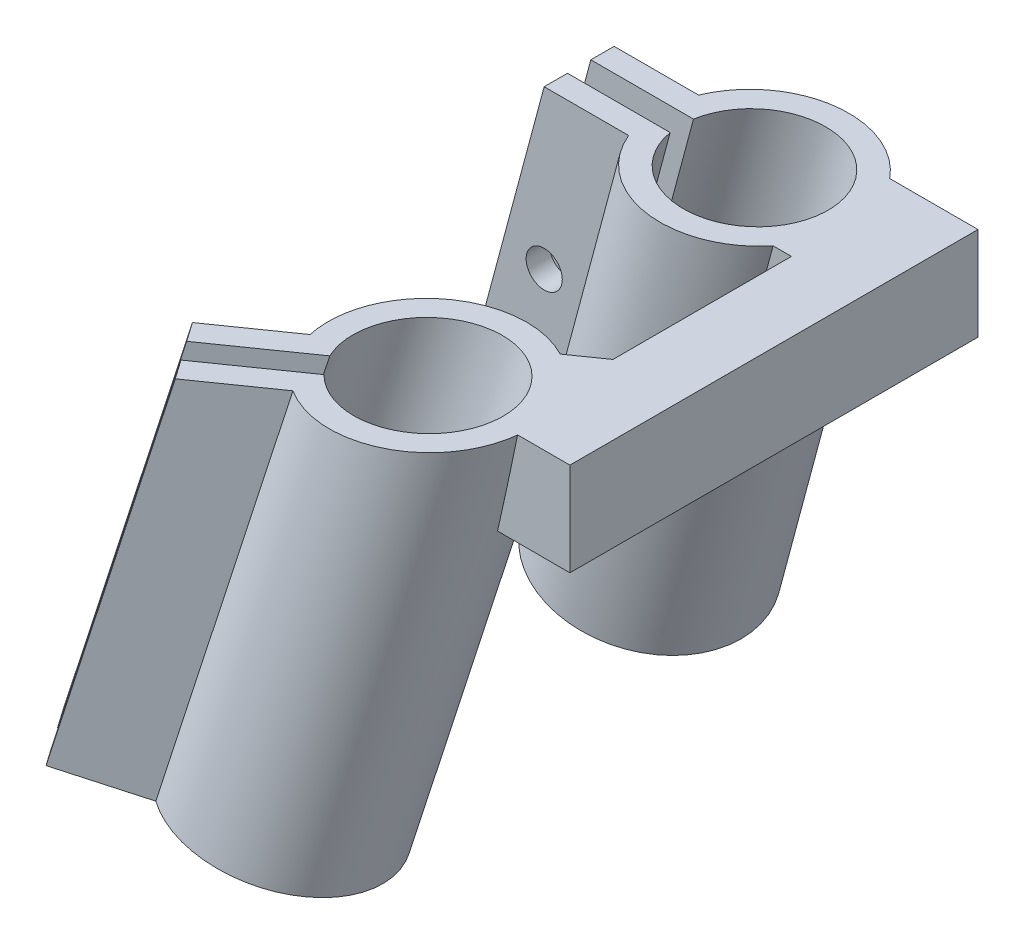
ISO-10303-21;
HEADER;
FILE_DESCRIPTION(('STEP AP214'),'2;1');
FILE_NAME('part.step','',(''),(''),'','','');
FILE_SCHEMA(('AUTOMOTIVE_DESIGN { 1 0 10303 214 1 1 1 1 }'));
ENDSEC;
DATA;
#1=APPLICATION_CONTEXT('core data for automotive mechanical design processes');
#2=APPLICATION_PROTOCOL_DEFINITION('international standard','automotive_design',2000,#1);
#3=PRODUCT_CONTEXT('',#1,'mechanical');
#4=PRODUCT('Part','Part','',(#3));
#5=PRODUCT_RELATED_PRODUCT_CATEGORY('part','',(#4));
#6=PRODUCT_DEFINITION_FORMATION('','',#4);
#7=PRODUCT_DEFINITION_CONTEXT('part definition',#1,'design');
#8=PRODUCT_DEFINITION('design','',#6,#7);
#9=PRODUCT_DEFINITION_SHAPE('','',#8);
#10=(LENGTH_UNIT() NAMED_UNIT(*) SI_UNIT(.MILLI.,.METRE.));
#11=(NAMED_UNIT(*) PLANE_ANGLE_UNIT() SI_UNIT($,.RADIAN.));
#12=(NAMED_UNIT(*) SI_UNIT($,.STERADIAN.) SOLID_ANGLE_UNIT());
#13=UNCERTAINTY_MEASURE_WITH_UNIT(LENGTH_MEASURE(1.E-05),#10,'distance_accuracy_value','');
#14=(GEOMETRIC_REPRESENTATION_CONTEXT(3) GLOBAL_UNCERTAINTY_ASSIGNED_CONTEXT((#13)) GLOBAL_UNIT_ASSIGNED_CONTEXT((#10,
#11,#12)) REPRESENTATION_CONTEXT('',''));
#15=CARTESIAN_POINT('',(0.,0.,0.));
#16=DIRECTION('',(0.,0.,1.));
#17=DIRECTION('',(1.,0.,0.));
#18=AXIS2_PLACEMENT_3D('',#15,#16,#17);
#19=CARTESIAN_POINT('',(-20.0828491488153,-29.4671269609686,4.57689308289988));
#20=DIRECTION('',(0.212012149896649,0.96592582628907,-0.148452505549681));
#21=DIRECTION('',(-0.976748652139604,0.2143876641588,0.));
#22=AXIS2_PLACEMENT_3D('',#19,#20,#21);
#23=CYLINDRICAL_SURFACE('',#22,6.1);
#24=DIRECTION('',(0.212012149896649,0.96592582628907,-0.148452505549681));
#25=VECTOR('',#24,1.);
#26=CARTESIAN_POINT('',(-25.417692844176,-27.9096899431465,7.09161626480049));
#27=LINE('',#26,#25);
#28=CARTESIAN_POINT('',(-25.3116867692277,-27.426727030002,7.01739001202565));
#29=VERTEX_POINT('',#28);
#30=CARTESIAN_POINT('',(-18.4137989806348,4.00000000000001,2.1874369847282));
#31=VERTEX_POINT('',#30);
#32=EDGE_CURVE('E54',#29,#31,#27,.T.);
#33=ORIENTED_EDGE('',*,*,#32,.F.);
#34=CARTESIAN_POINT('',(-19.976843073867,-28.9841640478241,4.50266683012504));
#35=DIRECTION('',(-0.212012149896649,-0.96592582628907,0.148452505549681));
#36=DIRECTION('',(0.976748652139604,-0.214387664158799,0.));
#37=AXIS2_PLACEMENT_3D('',#34,#35,#36);
#38=CIRCLE('',#37,6.1);
#39=CARTESIAN_POINT('',(-24.1645338965256,-27.426727030002,8.65569410060363));
#40=VERTEX_POINT('',#39);
#41=EDGE_CURVE('E58',#29,#40,#38,.T.);
#42=ORIENTED_EDGE('',*,*,#41,.T.);
#43=DIRECTION('',(0.212012149896649,0.96592582628907,-0.148452505549681));
#44=VECTOR('',#43,1.);
#45=CARTESIAN_POINT('',(-24.2705399714739,-27.9096899431465,8.72992035337847));
#46=LINE('',#45,#44);
#47=CARTESIAN_POINT('',(-17.2666461079327,4.00000000000001,3.82574107330618));
#48=VERTEX_POINT('',#47);
#49=EDGE_CURVE('E227',#40,#48,#46,.T.);
#50=ORIENTED_EDGE('',*,*,#49,.T.);
#51=CARTESIAN_POINT('',(-12.7371116762823,4.,-0.56664766907732));
#52=DIRECTION('',(0.,1.,0.));
#53=DIRECTION('',(-0.819152044288991,0.,0.573576436351047));
#54=AXIS2_PLACEMENT_3D('',#51,#52,#53);
#55=ELLIPSE('',#54,6.3151847005015,6.1);
#56=EDGE_CURVE('E271',#31,#48,#55,.F.);
#57=ORIENTED_EDGE('',*,*,#56,.F.);
#58=EDGE_LOOP('',(#33,#42,#50,#57));
#59=FACE_BOUND('',#58,.T.);
#60=ADVANCED_FACE('F39',(#59),#23,.F.);
#61=CARTESIAN_POINT('',(-6.52879480020904,4.,-9.32408528034679));
#62=DIRECTION('',(-0.573576436351047,0.,-0.819152044288991));
#63=DIRECTION('',(-0.819152044288991,0.,0.573576436351047));
#64=AXIS2_PLACEMENT_3D('',#61,#62,#63);
#65=PLANE('',#64);
#66=DIRECTION('',(0.212012149896649,0.96592582628907,-0.148452505549681));
#67=VECTOR('',#66,1.);
#68=CARTESIAN_POINT('',(-16.4187694416062,-31.3434881347056,-2.39905048373759));
#69=LINE('',#68,#67);
#70=CARTESIAN_POINT('',(-8.66118733711535,4.,-7.83096795158286));
#71=VERTEX_POINT('',#70);
#72=CARTESIAN_POINT('',(-10.4171163670796,-4.,-6.60145320824061));
#73=VERTEX_POINT('',#72);
#74=EDGE_CURVE('E312',#71,#73,#69,.F.);
#75=ORIENTED_EDGE('',*,*,#74,.F.);
#76=DIRECTION('',(0.819152044288991,0.,-0.573576436351047));
#77=VECTOR('',#76,1.);
#78=CARTESIAN_POINT('',(-6.52879480020904,4.,-9.32408528034679));
#79=LINE('',#78,#77);
#80=CARTESIAN_POINT('',(-6.,4.,-9.69435138561925));
#81=VERTEX_POINT('',#80);
#82=EDGE_CURVE('E411',#71,#81,#79,.T.);
#83=ORIENTED_EDGE('',*,*,#82,.T.);
#84=DIRECTION('',(0.,-1.,0.));
#85=VECTOR('',#84,1.);
#86=CARTESIAN_POINT('',(-6.,4.,-9.69435138561925));
#87=LINE('',#86,#85);
#88=CARTESIAN_POINT('',(-6.,-4.,-9.69435138561925));
#89=VERTEX_POINT('',#88);
#90=EDGE_CURVE('E426',#81,#89,#87,.T.);
#91=ORIENTED_EDGE('',*,*,#90,.T.);
#92=DIRECTION('',(0.819152044288991,0.,-0.573576436351047));
#93=VECTOR('',#92,1.);
#94=CARTESIAN_POINT('',(-6.52879480020904,-4.,-9.32408528034679));
#95=LINE('',#94,#93);
#96=EDGE_CURVE('E410',#73,#89,#95,.T.);
#97=ORIENTED_EDGE('',*,*,#96,.F.);
#98=EDGE_LOOP('',(#75,#83,#91,#97));
#99=FACE_BOUND('',#98,.T.);
#100=ADVANCED_FACE('F41',(#99),#65,.T.);
#101=CARTESIAN_POINT('',(0.,4.,0.));
#102=DIRECTION('',(0.,0.,1.));
#103=DIRECTION('',(1.,0.,0.));
#104=AXIS2_PLACEMENT_3D('',#101,#102,#103);
#105=PLANE('',#104);
#106=CARTESIAN_POINT('',(-13.5463684154001,0.313032131444138,0.));
#107=DIRECTION('',(0.,0.,1.));
#108=DIRECTION('',(0.2143876641588,0.976748652139604,0.));
#109=AXIS2_PLACEMENT_3D('',#106,#107,#108);
#110=ELLIPSE('',#109,54.5629052875045,8.1);
#111=CARTESIAN_POINT('',(-6.20993348731184,-4.,0.));
#112=VERTEX_POINT('',#111);
#113=CARTESIAN_POINT('',(-4.48720229842507,4.,0.));
#114=VERTEX_POINT('',#113);
#115=EDGE_CURVE('E295',#112,#114,#110,.T.);
#116=ORIENTED_EDGE('',*,*,#115,.F.);
#117=DIRECTION('',(-1.,0.,0.));
#118=VECTOR('',#117,1.);
#119=CARTESIAN_POINT('',(0.,-4.,0.));
#120=LINE('',#119,#118);
#121=CARTESIAN_POINT('',(0.,-4.,0.));
#122=VERTEX_POINT('',#121);
#123=EDGE_CURVE('E428',#122,#112,#120,.T.);
#124=ORIENTED_EDGE('',*,*,#123,.F.);
#125=DIRECTION('',(0.,-1.,0.));
#126=VECTOR('',#125,1.);
#127=CARTESIAN_POINT('',(0.,4.,0.));
#128=LINE('',#127,#126);
#129=CARTESIAN_POINT('',(0.,4.,0.));
#130=VERTEX_POINT('',#129);
#131=EDGE_CURVE('E448',#130,#122,#128,.T.);
#132=ORIENTED_EDGE('',*,*,#131,.F.);
#133=DIRECTION('',(-1.,0.,0.));
#134=VECTOR('',#133,1.);
#135=CARTESIAN_POINT('',(0.,4.,0.));
#136=LINE('',#135,#134);
#137=EDGE_CURVE('E413',#130,#114,#136,.T.);
#138=ORIENTED_EDGE('',*,*,#137,.T.);
#139=EDGE_LOOP('',(#116,#124,#132,#138));
#140=FACE_BOUND('',#139,.T.);
#141=ADVANCED_FACE('F476',(#140),#105,.T.);
#142=CARTESIAN_POINT('',(0.,4.,0.));
#143=DIRECTION('',(-1.,0.,0.));
#144=DIRECTION('',(0.,0.,1.));
#145=AXIS2_PLACEMENT_3D('',#142,#143,#144);
#146=PLANE('',#145);
#147=DIRECTION('',(0.,0.,-1.));
#148=VECTOR('',#147,1.);
#149=CARTESIAN_POINT('',(0.,-4.,0.));
#150=LINE('',#149,#148);
#151=CARTESIAN_POINT('',(0.,-4.,-35.));
#152=VERTEX_POINT('',#151);
#153=EDGE_CURVE('E431',#122,#152,#150,.T.);
#154=ORIENTED_EDGE('',*,*,#153,.T.);
#155=DIRECTION('',(0.,-1.,0.));
#156=VECTOR('',#155,1.);
#157=CARTESIAN_POINT('',(0.,4.,-35.));
#158=LINE('',#157,#156);
#159=CARTESIAN_POINT('',(0.,4.,-35.));
#160=VERTEX_POINT('',#159);
#161=EDGE_CURVE('E445',#160,#152,#158,.T.);
#162=ORIENTED_EDGE('',*,*,#161,.F.);
#163=DIRECTION('',(0.,0.,-1.));
#164=VECTOR('',#163,1.);
#165=CARTESIAN_POINT('',(0.,4.,0.));
#166=LINE('',#165,#164);
#167=EDGE_CURVE('E416',#130,#160,#166,.T.);
#168=ORIENTED_EDGE('',*,*,#167,.F.);
#169=ORIENTED_EDGE('',*,*,#131,.T.);
#170=EDGE_LOOP('',(#154,#162,#168,#169));
#171=FACE_BOUND('',#170,.T.);
#172=ADVANCED_FACE('F587',(#171),#146,.F.);
#173=CARTESIAN_POINT('',(0.,4.,-35.));
#174=DIRECTION('',(0.,0.,1.));
#175=DIRECTION('',(1.,0.,0.));
#176=AXIS2_PLACEMENT_3D('',#173,#174,#175);
#177=PLANE('',#176);
#178=DIRECTION('',(-1.,0.,0.));
#179=VECTOR('',#178,1.);
#180=CARTESIAN_POINT('',(0.,-4.,-35.));
#181=LINE('',#180,#179);
#182=CARTESIAN_POINT('',(-9.71778621181587,-4.,-35.));
#183=VERTEX_POINT('',#182);
#184=EDGE_CURVE('E433',#152,#183,#181,.T.);
#185=ORIENTED_EDGE('',*,*,#184,.T.);
#186=DIRECTION('',(0.258819045102514,0.96592582628907,0.));
#187=VECTOR('',#186,1.);
#188=CARTESIAN_POINT('',(-16.9836242138455,-31.11647658314,-35.));
#189=LINE('',#188,#187);
#190=CARTESIAN_POINT('',(-7.57419267236695,4.,-35.));
#191=VERTEX_POINT('',#190);
#192=EDGE_CURVE('E408',#183,#191,#189,.T.);
#193=ORIENTED_EDGE('',*,*,#192,.T.);
#194=DIRECTION('',(-1.,0.,0.));
#195=VECTOR('',#194,1.);
#196=CARTESIAN_POINT('',(0.,4.,-35.));
#197=LINE('',#196,#195);
#198=EDGE_CURVE('E418',#160,#191,#197,.T.);
#199=ORIENTED_EDGE('',*,*,#198,.F.);
#200=ORIENTED_EDGE('',*,*,#161,.T.);
#201=EDGE_LOOP('',(#185,#193,#199,#200));
#202=FACE_BOUND('',#201,.T.);
#203=ADVANCED_FACE('F544',(#202),#177,.F.);
#204=CARTESIAN_POINT('',(0.,4.,-25.));
#205=DIRECTION('',(0.,0.,-1.));
#206=DIRECTION('',(-1.,0.,0.));
#207=AXIS2_PLACEMENT_3D('',#204,#205,#206);
#208=PLANE('',#207);
#209=DIRECTION('',(1.,0.,0.));
#210=VECTOR('',#209,1.);
#211=CARTESIAN_POINT('',(0.,4.,-25.));
#212=LINE('',#211,#210);
#213=CARTESIAN_POINT('',(-7.57419267236695,4.,-25.));
#214=VERTEX_POINT('',#213);
#215=CARTESIAN_POINT('',(-6.,4.,-25.));
#216=VERTEX_POINT('',#215);
#217=EDGE_CURVE('E421',#214,#216,#212,.T.);
#218=ORIENTED_EDGE('',*,*,#217,.F.);
#219=DIRECTION('',(0.258819045102514,0.96592582628907,0.));
#220=VECTOR('',#219,1.);
#221=CARTESIAN_POINT('',(-16.9836242138455,-31.11647658314,-25.));
#222=LINE('',#221,#220);
#223=CARTESIAN_POINT('',(-9.71778621181587,-4.,-25.));
#224=VERTEX_POINT('',#223);
#225=EDGE_CURVE('E392',#214,#224,#222,.F.);
#226=ORIENTED_EDGE('',*,*,#225,.T.);
#227=DIRECTION('',(1.,0.,0.));
#228=VECTOR('',#227,1.);
#229=CARTESIAN_POINT('',(0.,-4.,-25.));
#230=LINE('',#229,#228);
#231=CARTESIAN_POINT('',(-6.,-4.,-25.));
#232=VERTEX_POINT('',#231);
#233=EDGE_CURVE('E436',#224,#232,#230,.T.);
#234=ORIENTED_EDGE('',*,*,#233,.T.);
#235=DIRECTION('',(0.,-1.,0.));
#236=VECTOR('',#235,1.);
#237=CARTESIAN_POINT('',(-6.,4.,-25.));
#238=LINE('',#237,#236);
#239=EDGE_CURVE('E442',#216,#232,#238,.T.);
#240=ORIENTED_EDGE('',*,*,#239,.F.);
#241=EDGE_LOOP('',(#218,#226,#234,#240));
#242=FACE_BOUND('',#241,.T.);
#243=ADVANCED_FACE('F552',(#242),#208,.F.);
#244=CARTESIAN_POINT('',(-6.,4.,0.));
#245=DIRECTION('',(1.,0.,0.));
#246=DIRECTION('',(0.,0.,-1.));
#247=AXIS2_PLACEMENT_3D('',#244,#245,#246);
#248=PLANE('',#247);
#249=DIRECTION('',(0.,0.,1.));
#250=VECTOR('',#249,1.);
#251=CARTESIAN_POINT('',(-6.,-4.,0.));
#252=LINE('',#251,#250);
#253=EDGE_CURVE('E414',#232,#89,#252,.T.);
#254=ORIENTED_EDGE('',*,*,#253,.T.);
#255=ORIENTED_EDGE('',*,*,#90,.F.);
#256=DIRECTION('',(0.,0.,1.));
#257=VECTOR('',#256,1.);
#258=CARTESIAN_POINT('',(-6.,4.,0.));
#259=LINE('',#258,#257);
#260=EDGE_CURVE('E423',#216,#81,#259,.T.);
#261=ORIENTED_EDGE('',*,*,#260,.F.);
#262=ORIENTED_EDGE('',*,*,#239,.T.);
#263=EDGE_LOOP('',(#254,#255,#261,#262));
#264=FACE_BOUND('',#263,.T.);
#265=ADVANCED_FACE('F555',(#264),#248,.F.);
#266=CARTESIAN_POINT('',(0.,4.,0.));
#267=DIRECTION('',(0.,1.,0.));
#268=DIRECTION('',(0.,0.,1.));
#269=AXIS2_PLACEMENT_3D('',#266,#267,#268);
#270=PLANE('',#269);
#271=ORIENTED_EDGE('',*,*,#82,.F.);
#272=CARTESIAN_POINT('',(-12.7371116762823,4.,-0.56664766907732));
#273=DIRECTION('',(0.,1.,0.));
#274=DIRECTION('',(-0.819152044288991,0.,0.573576436351047));
#275=AXIS2_PLACEMENT_3D('',#272,#273,#274);
#276=ELLIPSE('',#275,8.38573706132166,8.1);
#277=CARTESIAN_POINT('',(-20.8385261873522,4.,1.44370007545097));
#278=VERTEX_POINT('',#277);
#279=EDGE_CURVE('E261',#71,#278,#276,.T.);
#280=ORIENTED_EDGE('',*,*,#279,.T.);
#281=DIRECTION('',(-0.819152044288991,0.,0.573576436351047));
#282=VECTOR('',#281,1.);
#283=CARTESIAN_POINT('',(-19.9409419000905,4.,0.815204791331786));
#284=LINE('',#283,#282);
#285=CARTESIAN_POINT('',(-26.7748663844585,4.,5.60037023084213));
#286=VERTEX_POINT('',#285);
#287=EDGE_CURVE('E255',#278,#286,#284,.T.);
#288=ORIENTED_EDGE('',*,*,#287,.T.);
#289=DIRECTION('',(0.573576436351048,0.,0.819152044288991));
#290=VECTOR('',#289,1.);
#291=CARTESIAN_POINT('',(-25.6277135117564,4.,7.23867431942012));
#292=LINE('',#291,#290);
#293=CARTESIAN_POINT('',(-25.6277135117564,4.00000000000001,7.23867431942012));
#294=VERTEX_POINT('',#293);
#295=EDGE_CURVE('E251',#286,#294,#292,.T.);
#296=ORIENTED_EDGE('',*,*,#295,.T.);
#297=DIRECTION('',(0.819152044288991,0.,-0.573576436351047));
#298=VECTOR('',#297,1.);
#299=CARTESIAN_POINT('',(-12.0631151394871,4.,-2.25935971363001));
#300=LINE('',#299,#298);
#301=EDGE_CURVE('E250',#294,#31,#300,.T.);
#302=ORIENTED_EDGE('',*,*,#301,.T.);
#303=ORIENTED_EDGE('',*,*,#56,.T.);
#304=DIRECTION('',(-0.819152044288991,0.,0.573576436351047));
#305=VECTOR('',#304,1.);
#306=CARTESIAN_POINT('',(-10.915962266785,4.,-0.621055625052023));
#307=LINE('',#306,#305);
#308=CARTESIAN_POINT('',(-24.4805606390543,4.,8.8769784079981));
#309=VERTEX_POINT('',#308);
#310=EDGE_CURVE('E268',#48,#309,#307,.T.);
#311=ORIENTED_EDGE('',*,*,#310,.T.);
#312=DIRECTION('',(0.573576436351047,0.,0.819152044288991));
#313=VECTOR('',#312,1.);
#314=CARTESIAN_POINT('',(-24.4805606390543,4.,8.8769784079981));
#315=LINE('',#314,#313);
#316=CARTESIAN_POINT('',(-23.3334077663522,4.00000000000001,10.5152824965761));
#317=VERTEX_POINT('',#316);
#318=EDGE_CURVE('E265',#309,#317,#315,.T.);
#319=ORIENTED_EDGE('',*,*,#318,.T.);
#320=DIRECTION('',(0.819152044288991,0.,-0.573576436351047));
#321=VECTOR('',#320,1.);
#322=CARTESIAN_POINT('',(-16.4994832819842,4.,5.73011705706573));
#323=LINE('',#322,#321);
#324=CARTESIAN_POINT('',(-17.3970675692459,4.,6.35861234118491));
#325=VERTEX_POINT('',#324);
#326=EDGE_CURVE('E262',#317,#325,#323,.T.);
#327=ORIENTED_EDGE('',*,*,#326,.T.);
#328=EDGE_CURVE('E258',#325,#114,#276,.T.);
#329=ORIENTED_EDGE('',*,*,#328,.T.);
#330=ORIENTED_EDGE('',*,*,#137,.F.);
#331=ORIENTED_EDGE('',*,*,#167,.T.);
#332=ORIENTED_EDGE('',*,*,#198,.T.);
#333=CARTESIAN_POINT('',(-14.1715911610526,4.,-30.));
#334=DIRECTION('',(0.,1.,0.));
#335=DIRECTION('',(-1.,0.,0.));
#336=AXIS2_PLACEMENT_3D('',#333,#334,#335);
#337=ELLIPSE('',#336,8.38573706132166,8.1);
#338=CARTESIAN_POINT('',(-21.9609695145608,4.,-33.));
#339=VERTEX_POINT('',#338);
#340=EDGE_CURVE('E356',#191,#339,#337,.T.);
#341=ORIENTED_EDGE('',*,*,#340,.T.);
#342=DIRECTION('',(-1.,0.,0.));
#343=VECTOR('',#342,1.);
#344=CARTESIAN_POINT('',(-21.0944988664875,4.,-33.));
#345=LINE('',#344,#343);
#346=CARTESIAN_POINT('',(-29.2079027774314,4.,-33.));
#347=VERTEX_POINT('',#346);
#348=EDGE_CURVE('E350',#339,#347,#345,.T.);
#349=ORIENTED_EDGE('',*,*,#348,.T.);
#350=DIRECTION('',(0.,0.,1.));
#351=VECTOR('',#350,1.);
#352=CARTESIAN_POINT('',(-29.2079027774314,4.,-31.0000000000001));
#353=LINE('',#352,#351);
#354=CARTESIAN_POINT('',(-29.2079027774314,4.,-31.));
#355=VERTEX_POINT('',#354);
#356=EDGE_CURVE('E346',#347,#355,#353,.T.);
#357=ORIENTED_EDGE('',*,*,#356,.T.);
#358=DIRECTION('',(1.,0.,0.));
#359=VECTOR('',#358,1.);
#360=CARTESIAN_POINT('',(-12.8778632188973,4.,-31.));
#361=LINE('',#360,#359);
#362=CARTESIAN_POINT('',(-20.4013392323411,4.,-31.));
#363=VERTEX_POINT('',#362);
#364=EDGE_CURVE('E345',#355,#363,#361,.T.);
#365=ORIENTED_EDGE('',*,*,#364,.T.);
#366=CARTESIAN_POINT('',(-14.1715911610526,4.,-30.));
#367=DIRECTION('',(0.,1.,0.));
#368=DIRECTION('',(-1.,0.,0.));
#369=AXIS2_PLACEMENT_3D('',#366,#367,#368);
#370=ELLIPSE('',#369,6.31518470050149,6.1);
#371=CARTESIAN_POINT('',(-20.4013392323411,4.,-29.));
#372=VERTEX_POINT('',#371);
#373=EDGE_CURVE('E366',#363,#372,#370,.F.);
#374=ORIENTED_EDGE('',*,*,#373,.T.);
#375=DIRECTION('',(-1.,0.,0.));
#376=VECTOR('',#375,1.);
#377=CARTESIAN_POINT('',(-12.8778632188973,4.,-29.));
#378=LINE('',#377,#376);
#379=CARTESIAN_POINT('',(-29.2079027774314,4.,-29.));
#380=VERTEX_POINT('',#379);
#381=EDGE_CURVE('E363',#372,#380,#378,.T.);
#382=ORIENTED_EDGE('',*,*,#381,.T.);
#383=DIRECTION('',(0.,0.,1.));
#384=VECTOR('',#383,1.);
#385=CARTESIAN_POINT('',(-29.2079027774314,4.,-28.9999999999999));
#386=LINE('',#385,#384);
#387=CARTESIAN_POINT('',(-29.2079027774314,4.,-27.));
#388=VERTEX_POINT('',#387);
#389=EDGE_CURVE('E360',#380,#388,#386,.T.);
#390=ORIENTED_EDGE('',*,*,#389,.T.);
#391=DIRECTION('',(1.,0.,0.));
#392=VECTOR('',#391,1.);
#393=CARTESIAN_POINT('',(-21.0944988664875,4.,-27.));
#394=LINE('',#393,#392);
#395=CARTESIAN_POINT('',(-21.9609695145608,4.,-27.));
#396=VERTEX_POINT('',#395);
#397=EDGE_CURVE('E357',#388,#396,#394,.T.);
#398=ORIENTED_EDGE('',*,*,#397,.T.);
#399=EDGE_CURVE('E353',#396,#214,#337,.T.);
#400=ORIENTED_EDGE('',*,*,#399,.T.);
#401=ORIENTED_EDGE('',*,*,#217,.T.);
#402=ORIENTED_EDGE('',*,*,#260,.T.);
#403=EDGE_LOOP('',(#271,#280,#288,#296,#302,#303,#311,#319,#327,#329,#330,#331,#332,#341,#349,
#357,#365,#374,#382,#390,#398,#400,#401,#402));
#404=FACE_BOUND('',#403,.T.);
#405=ADVANCED_FACE('F527',(#404),#270,.T.);
#406=CARTESIAN_POINT('',(0.,-4.,0.));
#407=DIRECTION('',(0.,1.,0.));
#408=DIRECTION('',(0.,0.,1.));
#409=AXIS2_PLACEMENT_3D('',#406,#407,#408);
#410=PLANE('',#409);
#411=ORIENTED_EDGE('',*,*,#123,.T.);
#412=CARTESIAN_POINT('',(-14.4930407062466,-4.,0.662867074264923));
#413=DIRECTION('',(0.,1.,0.));
#414=DIRECTION('',(0.819152044288991,0.,-0.573576436351047));
#415=AXIS2_PLACEMENT_3D('',#412,#413,#414);
#416=ELLIPSE('',#415,8.38573706132166,8.1);
#417=EDGE_CURVE('E11',#112,#73,#416,.T.);
#418=ORIENTED_EDGE('',*,*,#417,.T.);
#419=ORIENTED_EDGE('',*,*,#96,.T.);
#420=ORIENTED_EDGE('',*,*,#253,.F.);
#421=ORIENTED_EDGE('',*,*,#233,.F.);
#422=CARTESIAN_POINT('',(-16.3151847005015,-4.,-30.));
#423=DIRECTION('',(0.,1.,0.));
#424=DIRECTION('',(1.,0.,0.));
#425=AXIS2_PLACEMENT_3D('',#422,#423,#424);
#426=ELLIPSE('',#425,8.38573706132166,8.1);
#427=EDGE_CURVE('E47',#224,#183,#426,.T.);
#428=ORIENTED_EDGE('',*,*,#427,.T.);
#429=ORIENTED_EDGE('',*,*,#184,.F.);
#430=ORIENTED_EDGE('',*,*,#153,.F.);
#431=EDGE_LOOP('',(#411,#418,#419,#420,#421,#428,#429,#430));
#432=FACE_BOUND('',#431,.T.);
#433=ADVANCED_FACE('F510',(#432),#410,.F.);
#434=CARTESIAN_POINT('',(-23.1390808032337,-29.4671269609686,-30.));
#435=DIRECTION('',(0.258819045102514,0.96592582628907,0.));
#436=DIRECTION('',(-0.96592582628907,0.258819045102514,0.));
#437=AXIS2_PLACEMENT_3D('',#434,#435,#436);
#438=CYLINDRICAL_SURFACE('',#437,8.1);
#439=ORIENTED_EDGE('',*,*,#192,.F.);
#440=ORIENTED_EDGE('',*,*,#427,.F.);
#441=ORIENTED_EDGE('',*,*,#225,.F.);
#442=ORIENTED_EDGE('',*,*,#399,.F.);
#443=DIRECTION('',(0.258819045102514,0.96592582628907,0.));
#444=VECTOR('',#443,1.);
#445=CARTESIAN_POINT('',(-30.4066697469013,-27.5197823725916,-27.));
#446=LINE('',#445,#444);
#447=CARTESIAN_POINT('',(-30.4066697469013,-27.5197823725916,-27.));
#448=VERTEX_POINT('',#447);
#449=EDGE_CURVE('E400',#448,#396,#446,.T.);
#450=ORIENTED_EDGE('',*,*,#449,.F.);
#451=CARTESIAN_POINT('',(-23.1390808032337,-29.4671269609686,-30.));
#452=DIRECTION('',(0.258819045102514,0.96592582628907,0.));
#453=DIRECTION('',(-0.96592582628907,0.258819045102514,0.));
#454=AXIS2_PLACEMENT_3D('',#451,#452,#453);
#455=CIRCLE('',#454,8.1);
#456=CARTESIAN_POINT('',(-30.4066697469013,-27.5197823725916,-33.));
#457=VERTEX_POINT('',#456);
#458=EDGE_CURVE('E378',#448,#457,#455,.T.);
#459=ORIENTED_EDGE('',*,*,#458,.T.);
#460=DIRECTION('',(0.258819045102514,0.96592582628907,0.));
#461=VECTOR('',#460,1.);
#462=CARTESIAN_POINT('',(-30.4066697469013,-27.5197823725916,-33.));
#463=LINE('',#462,#461);
#464=EDGE_CURVE('E397',#457,#339,#463,.T.);
#465=ORIENTED_EDGE('',*,*,#464,.T.);
#466=ORIENTED_EDGE('',*,*,#340,.F.);
#467=EDGE_LOOP('',(#439,#440,#441,#442,#450,#459,#465,#466));
#468=FACE_BOUND('',#467,.T.);
#469=ADVANCED_FACE('F507',(#468),#438,.T.);
#470=CARTESIAN_POINT('',(-23.1390808032337,-29.4671269609686,-30.));
#471=DIRECTION('',(0.258819045102514,0.96592582628907,0.));
#472=DIRECTION('',(-0.96592582628907,0.258819045102514,0.));
#473=AXIS2_PLACEMENT_3D('',#470,#471,#472);
#474=CYLINDRICAL_SURFACE('',#473,6.1);
#475=CARTESIAN_POINT('',(-23.0096712806825,-28.9841640478241,-30.));
#476=DIRECTION('',(0.258819045102515,0.96592582628907,0.));
#477=DIRECTION('',(-0.96592582628907,0.258819045102515,0.));
#478=AXIS2_PLACEMENT_3D('',#475,#476,#477);
#479=CIRCLE('',#478,6.1);
#480=CARTESIAN_POINT('',(-28.8221053607833,-27.426727030002,-29.));
#481=VERTEX_POINT('',#480);
#482=CARTESIAN_POINT('',(-28.8221053607833,-27.426727030002,-31.));
#483=VERTEX_POINT('',#482);
#484=EDGE_CURVE('E332',#481,#483,#479,.T.);
#485=ORIENTED_EDGE('',*,*,#484,.F.);
#486=DIRECTION('',(0.258819045102514,0.96592582628907,0.));
#487=VECTOR('',#486,1.);
#488=CARTESIAN_POINT('',(-28.9515148833345,-27.9096899431465,-29.));
#489=LINE('',#488,#487);
#490=EDGE_CURVE('E389',#481,#372,#489,.T.);
#491=ORIENTED_EDGE('',*,*,#490,.T.);
#492=ORIENTED_EDGE('',*,*,#373,.F.);
#493=DIRECTION('',(0.258819045102514,0.96592582628907,0.));
#494=VECTOR('',#493,1.);
#495=CARTESIAN_POINT('',(-28.9515148833345,-27.9096899431465,-31.));
#496=LINE('',#495,#494);
#497=EDGE_CURVE('E390',#483,#363,#496,.T.);
#498=ORIENTED_EDGE('',*,*,#497,.F.);
#499=EDGE_LOOP('',(#485,#491,#492,#498));
#500=FACE_BOUND('',#499,.T.);
#501=ADVANCED_FACE('F498',(#500),#474,.F.);
#502=CARTESIAN_POINT('',(-28.9515148833345,-27.9096899431465,-31.));
#503=DIRECTION('',(0.,0.,1.));
#504=DIRECTION('',(1.,0.,0.));
#505=AXIS2_PLACEMENT_3D('',#502,#503,#504);
#506=PLANE('',#505);
#507=DIRECTION('',(0.96592582628907,-0.258819045102514,0.));
#508=VECTOR('',#507,1.);
#509=CARTESIAN_POINT('',(-28.9515148833345,-27.9096899431465,-31.));
#510=LINE('',#509,#508);
#511=CARTESIAN_POINT('',(-37.1681505309248,-25.708049056874,-31.));
#512=VERTEX_POINT('',#511);
#513=CARTESIAN_POINT('',(-27.9696757639321,-28.1727729422877,-31.));
#514=VERTEX_POINT('',#513);
#515=EDGE_CURVE('E387',#512,#514,#510,.T.);
#516=ORIENTED_EDGE('',*,*,#515,.T.);
#517=DIRECTION('',(-0.258819045102515,-0.96592582628907,0.));
#518=VECTOR('',#517,1.);
#519=CARTESIAN_POINT('',(-27.8402662413809,-27.6898100291431,-31.));
#520=LINE('',#519,#518);
#521=CARTESIAN_POINT('',(-27.8402662413809,-27.6898100291431,-31.));
#522=VERTEX_POINT('',#521);
#523=EDGE_CURVE('E324',#522,#514,#520,.T.);
#524=ORIENTED_EDGE('',*,*,#523,.F.);
#525=DIRECTION('',(0.96592582628907,-0.258819045102516,0.));
#526=VECTOR('',#525,1.);
#527=CARTESIAN_POINT('',(-29.017854153749,-27.3742762990075,-31.));
#528=LINE('',#527,#526);
#529=EDGE_CURVE('E322',#483,#522,#528,.T.);
#530=ORIENTED_EDGE('',*,*,#529,.F.);
#531=ORIENTED_EDGE('',*,*,#497,.T.);
#532=ORIENTED_EDGE('',*,*,#364,.F.);
#533=DIRECTION('',(0.258819045102514,0.96592582628907,0.));
#534=VECTOR('',#533,1.);
#535=CARTESIAN_POINT('',(-37.1681505309248,-25.708049056874,-31.));
#536=LINE('',#535,#534);
#537=EDGE_CURVE('E393',#512,#355,#536,.T.);
#538=ORIENTED_EDGE('',*,*,#537,.F.);
#539=EDGE_LOOP('',(#516,#524,#530,#531,#532,#538));
#540=FACE_BOUND('',#539,.T.);
#541=CARTESIAN_POINT('',(-29.2062051622188,-9.54707273644968,-31.));
#542=DIRECTION('',(0.,0.,1.));
#543=DIRECTION('',(1.,0.,0.));
#544=AXIS2_PLACEMENT_3D('',#541,#542,#543);
#545=CIRCLE('',#544,1.55);
#546=CARTESIAN_POINT('',(-27.6562051622188,-9.54707273644968,-31.));
#547=VERTEX_POINT('',#546);
#548=EDGE_CURVE('E342',#547,#547,#545,.T.);
#549=ORIENTED_EDGE('',*,*,#548,.F.);
#550=EDGE_LOOP('',(#549));
#551=FACE_BOUND('',#550,.T.);
#552=ADVANCED_FACE('F494',(#540,#551),#506,.T.);
#553=CARTESIAN_POINT('',(-37.1681505309248,-25.708049056874,-31.));
#554=DIRECTION('',(-0.96592582628907,0.258819045102514,0.));
#555=DIRECTION('',(-0.258819045102514,-0.96592582628907,0.));
#556=AXIS2_PLACEMENT_3D('',#553,#554,#555);
#557=PLANE('',#556);
#558=ORIENTED_EDGE('',*,*,#537,.T.);
#559=ORIENTED_EDGE('',*,*,#356,.F.);
#560=DIRECTION('',(0.258819045102514,0.96592582628907,0.));
#561=VECTOR('',#560,1.);
#562=CARTESIAN_POINT('',(-37.1681505309248,-25.708049056874,-33.));
#563=LINE('',#562,#561);
#564=CARTESIAN_POINT('',(-37.1681505309248,-25.708049056874,-33.));
#565=VERTEX_POINT('',#564);
#566=EDGE_CURVE('E395',#565,#347,#563,.T.);
#567=ORIENTED_EDGE('',*,*,#566,.F.);
#568=DIRECTION('',(0.,0.,1.));
#569=VECTOR('',#568,1.);
#570=CARTESIAN_POINT('',(-37.1681505309248,-25.708049056874,-31.));
#571=LINE('',#570,#569);
#572=EDGE_CURVE('E384',#565,#512,#571,.T.);
#573=ORIENTED_EDGE('',*,*,#572,.T.);
#574=EDGE_LOOP('',(#558,#559,#567,#573));
#575=FACE_BOUND('',#574,.T.);
#576=ADVANCED_FACE('F497',(#575),#557,.T.);
#577=CARTESIAN_POINT('',(-37.1681505309248,-25.708049056874,-33.));
#578=DIRECTION('',(0.,0.,-1.));
#579=DIRECTION('',(-1.,0.,0.));
#580=AXIS2_PLACEMENT_3D('',#577,#578,#579);
#581=PLANE('',#580);
#582=CARTESIAN_POINT('',(-29.2062051622188,-9.54707273644968,-33.));
#583=DIRECTION('',(0.,0.,-1.));
#584=DIRECTION('',(-1.,0.,0.));
#585=AXIS2_PLACEMENT_3D('',#582,#583,#584);
#586=CIRCLE('',#585,1.55);
#587=CARTESIAN_POINT('',(-30.7562051622188,-9.54707273644968,-33.));
#588=VERTEX_POINT('',#587);
#589=EDGE_CURVE('E339',#588,#588,#586,.T.);
#590=ORIENTED_EDGE('',*,*,#589,.F.);
#591=EDGE_LOOP('',(#590));
#592=FACE_BOUND('',#591,.T.);
#593=ORIENTED_EDGE('',*,*,#566,.T.);
#594=ORIENTED_EDGE('',*,*,#348,.F.);
#595=ORIENTED_EDGE('',*,*,#464,.F.);
#596=DIRECTION('',(-0.96592582628907,0.258819045102515,0.));
#597=VECTOR('',#596,1.);
#598=CARTESIAN_POINT('',(-37.1681505309248,-25.708049056874,-33.));
#599=LINE('',#598,#597);
#600=EDGE_CURVE('E381',#457,#565,#599,.T.);
#601=ORIENTED_EDGE('',*,*,#600,.T.);
#602=EDGE_LOOP('',(#593,#594,#595,#601));
#603=FACE_BOUND('',#602,.T.);
#604=ADVANCED_FACE('F502',(#592,#603),#581,.T.);
#605=CARTESIAN_POINT('',(-37.1681505309248,-25.708049056874,-27.));
#606=DIRECTION('',(0.,0.,1.));
#607=DIRECTION('',(1.,0.,0.));
#608=AXIS2_PLACEMENT_3D('',#605,#606,#607);
#609=PLANE('',#608);
#610=CARTESIAN_POINT('',(-29.2062051622188,-9.54707273644968,-27.));
#611=DIRECTION('',(0.,0.,1.));
#612=DIRECTION('',(1.,0.,0.));
#613=AXIS2_PLACEMENT_3D('',#610,#611,#612);
#614=CIRCLE('',#613,1.55);
#615=CARTESIAN_POINT('',(-27.6562051622188,-9.54707273644968,-27.));
#616=VERTEX_POINT('',#615);
#617=EDGE_CURVE('E336',#616,#616,#614,.T.);
#618=ORIENTED_EDGE('',*,*,#617,.F.);
#619=EDGE_LOOP('',(#618));
#620=FACE_BOUND('',#619,.T.);
#621=ORIENTED_EDGE('',*,*,#449,.T.);
#622=ORIENTED_EDGE('',*,*,#397,.F.);
#623=DIRECTION('',(0.258819045102514,0.96592582628907,0.));
#624=VECTOR('',#623,1.);
#625=CARTESIAN_POINT('',(-37.1681505309248,-25.708049056874,-27.));
#626=LINE('',#625,#624);
#627=CARTESIAN_POINT('',(-37.1681505309248,-25.708049056874,-27.));
#628=VERTEX_POINT('',#627);
#629=EDGE_CURVE('E402',#628,#388,#626,.T.);
#630=ORIENTED_EDGE('',*,*,#629,.F.);
#631=DIRECTION('',(0.96592582628907,-0.258819045102515,0.));
#632=VECTOR('',#631,1.);
#633=CARTESIAN_POINT('',(-37.1681505309248,-25.708049056874,-27.));
#634=LINE('',#633,#632);
#635=EDGE_CURVE('E375',#628,#448,#634,.T.);
#636=ORIENTED_EDGE('',*,*,#635,.T.);
#637=EDGE_LOOP('',(#621,#622,#630,#636));
#638=FACE_BOUND('',#637,.T.);
#639=ADVANCED_FACE('F467',(#620,#638),#609,.T.);
#640=CARTESIAN_POINT('',(-37.1681505309248,-25.708049056874,-29.));
#641=DIRECTION('',(-0.96592582628907,0.258819045102514,0.));
#642=DIRECTION('',(-0.258819045102514,-0.96592582628907,0.));
#643=AXIS2_PLACEMENT_3D('',#640,#641,#642);
#644=PLANE('',#643);
#645=ORIENTED_EDGE('',*,*,#629,.T.);
#646=ORIENTED_EDGE('',*,*,#389,.F.);
#647=DIRECTION('',(0.258819045102514,0.96592582628907,0.));
#648=VECTOR('',#647,1.);
#649=CARTESIAN_POINT('',(-37.1681505309248,-25.708049056874,-29.));
#650=LINE('',#649,#648);
#651=CARTESIAN_POINT('',(-37.1681505309248,-25.708049056874,-29.));
#652=VERTEX_POINT('',#651);
#653=EDGE_CURVE('E404',#652,#380,#650,.T.);
#654=ORIENTED_EDGE('',*,*,#653,.F.);
#655=DIRECTION('',(0.,0.,1.));
#656=VECTOR('',#655,1.);
#657=CARTESIAN_POINT('',(-37.1681505309248,-25.708049056874,-29.));
#658=LINE('',#657,#656);
#659=EDGE_CURVE('E372',#652,#628,#658,.T.);
#660=ORIENTED_EDGE('',*,*,#659,.T.);
#661=EDGE_LOOP('',(#645,#646,#654,#660));
#662=FACE_BOUND('',#661,.T.);
#663=ADVANCED_FACE('F458',(#662),#644,.T.);
#664=CARTESIAN_POINT('',(-28.9515148833345,-27.9096899431465,-29.));
#665=DIRECTION('',(0.,0.,-1.));
#666=DIRECTION('',(-1.,0.,0.));
#667=AXIS2_PLACEMENT_3D('',#664,#665,#666);
#668=PLANE('',#667);
#669=DIRECTION('',(-0.96592582628907,0.258819045102514,0.));
#670=VECTOR('',#669,1.);
#671=CARTESIAN_POINT('',(-28.9515148833345,-27.9096899431465,-29.));
#672=LINE('',#671,#670);
#673=CARTESIAN_POINT('',(-27.9696757639321,-28.1727729422877,-29.));
#674=VERTEX_POINT('',#673);
#675=EDGE_CURVE('E349',#674,#652,#672,.T.);
#676=ORIENTED_EDGE('',*,*,#675,.T.);
#677=ORIENTED_EDGE('',*,*,#653,.T.);
#678=ORIENTED_EDGE('',*,*,#381,.F.);
#679=ORIENTED_EDGE('',*,*,#490,.F.);
#680=DIRECTION('',(-0.96592582628907,0.258819045102516,0.));
#681=VECTOR('',#680,1.);
#682=CARTESIAN_POINT('',(-29.017854153749,-27.3742762990075,-29.));
#683=LINE('',#682,#681);
#684=CARTESIAN_POINT('',(-27.8402662413809,-27.6898100291431,-29.));
#685=VERTEX_POINT('',#684);
#686=EDGE_CURVE('E319',#685,#481,#683,.T.);
#687=ORIENTED_EDGE('',*,*,#686,.F.);
#688=DIRECTION('',(-0.258819045102515,-0.96592582628907,0.));
#689=VECTOR('',#688,1.);
#690=CARTESIAN_POINT('',(-27.8402662413809,-27.6898100291431,-29.));
#691=LINE('',#690,#689);
#692=EDGE_CURVE('E329',#685,#674,#691,.T.);
#693=ORIENTED_EDGE('',*,*,#692,.T.);
#694=EDGE_LOOP('',(#676,#677,#678,#679,#687,#693));
#695=FACE_BOUND('',#694,.T.);
#696=CARTESIAN_POINT('',(-29.2062051622188,-9.54707273644968,-29.));
#697=DIRECTION('',(0.,0.,-1.));
#698=DIRECTION('',(-1.,0.,0.));
#699=AXIS2_PLACEMENT_3D('',#696,#697,#698);
#700=CIRCLE('',#699,1.55);
#701=CARTESIAN_POINT('',(-30.7562051622188,-9.54707273644968,-29.));
#702=VERTEX_POINT('',#701);
#703=EDGE_CURVE('E335',#702,#702,#700,.T.);
#704=ORIENTED_EDGE('',*,*,#703,.F.);
#705=EDGE_LOOP('',(#704));
#706=FACE_BOUND('',#705,.T.);
#707=ADVANCED_FACE('F455',(#695,#706),#668,.T.);
#708=CARTESIAN_POINT('',(-23.1390808032337,-29.4671269609686,-30.));
#709=DIRECTION('',(0.258819045102514,0.96592582628907,0.));
#710=DIRECTION('',(-0.96592582628907,0.258819045102514,0.));
#711=AXIS2_PLACEMENT_3D('',#708,#709,#710);
#712=PLANE('',#711);
#713=CARTESIAN_POINT('',(-23.1390808032337,-29.4671269609686,-30.));
#714=DIRECTION('',(-0.258819045102515,-0.96592582628907,0.));
#715=DIRECTION('',(-0.96592582628907,0.258819045102515,0.));
#716=AXIS2_PLACEMENT_3D('',#713,#714,#715);
#717=CIRCLE('',#716,5.1);
#718=EDGE_CURVE('E315',#514,#674,#717,.T.);
#719=ORIENTED_EDGE('',*,*,#718,.F.);
#720=ORIENTED_EDGE('',*,*,#515,.F.);
#721=ORIENTED_EDGE('',*,*,#572,.F.);
#722=ORIENTED_EDGE('',*,*,#600,.F.);
#723=ORIENTED_EDGE('',*,*,#458,.F.);
#724=ORIENTED_EDGE('',*,*,#635,.F.);
#725=ORIENTED_EDGE('',*,*,#659,.F.);
#726=ORIENTED_EDGE('',*,*,#675,.F.);
#727=EDGE_LOOP('',(#719,#720,#721,#722,#723,#724,#725,#726));
#728=FACE_BOUND('',#727,.T.);
#729=ADVANCED_FACE('F457',(#728),#712,.F.);
#730=CARTESIAN_POINT('',(-29.2062051622188,-9.54707273644968,0.));
#731=DIRECTION('',(0.,0.,-1.));
#732=DIRECTION('',(-1.,0.,0.));
#733=AXIS2_PLACEMENT_3D('',#730,#731,#732);
#734=CYLINDRICAL_SURFACE('',#733,1.55);
#735=ORIENTED_EDGE('',*,*,#617,.T.);
#736=EDGE_LOOP('',(#735));
#737=FACE_BOUND('',#736,.T.);
#738=ORIENTED_EDGE('',*,*,#703,.T.);
#739=EDGE_LOOP('',(#738));
#740=FACE_BOUND('',#739,.T.);
#741=ADVANCED_FACE('F453',(#737,#740),#734,.F.);
#742=ORIENTED_EDGE('',*,*,#548,.T.);
#743=EDGE_LOOP('',(#742));
#744=FACE_BOUND('',#743,.T.);
#745=ORIENTED_EDGE('',*,*,#589,.T.);
#746=EDGE_LOOP('',(#745));
#747=FACE_BOUND('',#746,.T.);
#748=ADVANCED_FACE('F489',(#744,#747),#734,.F.);
#749=CARTESIAN_POINT('',(-23.0096712806825,-28.9841640478241,-30.));
#750=DIRECTION('',(-0.258819045102515,-0.96592582628907,0.));
#751=DIRECTION('',(0.96592582628907,-0.258819045102515,0.));
#752=AXIS2_PLACEMENT_3D('',#749,#750,#751);
#753=CYLINDRICAL_SURFACE('',#752,5.1);
#754=ORIENTED_EDGE('',*,*,#718,.T.);
#755=ORIENTED_EDGE('',*,*,#692,.F.);
#756=CARTESIAN_POINT('',(-23.0096712806825,-28.9841640478241,-30.));
#757=DIRECTION('',(-0.258819045102515,-0.96592582628907,0.));
#758=DIRECTION('',(-0.96592582628907,0.258819045102515,0.));
#759=AXIS2_PLACEMENT_3D('',#756,#757,#758);
#760=CIRCLE('',#759,5.1);
#761=EDGE_CURVE('E316',#522,#685,#760,.T.);
#762=ORIENTED_EDGE('',*,*,#761,.F.);
#763=ORIENTED_EDGE('',*,*,#523,.T.);
#764=EDGE_LOOP('',(#754,#755,#762,#763));
#765=FACE_BOUND('',#764,.T.);
#766=ADVANCED_FACE('F485',(#765),#753,.F.);
#767=CARTESIAN_POINT('',(-23.0096712806825,-28.9841640478241,-30.));
#768=DIRECTION('',(0.258819045102515,0.96592582628907,0.));
#769=DIRECTION('',(-0.96592582628907,0.258819045102515,0.));
#770=AXIS2_PLACEMENT_3D('',#767,#768,#769);
#771=PLANE('',#770);
#772=ORIENTED_EDGE('',*,*,#686,.T.);
#773=ORIENTED_EDGE('',*,*,#484,.T.);
#774=ORIENTED_EDGE('',*,*,#529,.T.);
#775=ORIENTED_EDGE('',*,*,#761,.T.);
#776=EDGE_LOOP('',(#772,#773,#774,#775));
#777=FACE_BOUND('',#776,.T.);
#778=ADVANCED_FACE('F481',(#777),#771,.T.);
#779=CARTESIAN_POINT('',(-25.417692844176,-27.9096899431465,7.09161626480049));
#780=DIRECTION('',(0.573576436351047,0.,0.819152044288991));
#781=DIRECTION('',(0.819152044288991,0.,-0.573576436351047));
#782=AXIS2_PLACEMENT_3D('',#779,#780,#781);
#783=PLANE('',#782);
#784=DIRECTION('',(0.791240115236224,-0.258819045102515,-0.554032293222326));
#785=VECTOR('',#784,1.);
#786=CARTESIAN_POINT('',(-25.417692844176,-27.9096899431465,7.09161626480049));
#787=LINE('',#786,#785);
#788=CARTESIAN_POINT('',(-32.1483667320773,-25.708049056874,11.8044848583403));
#789=VERTEX_POINT('',#788);
#790=CARTESIAN_POINT('',(-24.209084891429,-28.3050323306339,6.24533986554683));
#791=VERTEX_POINT('',#790);
#792=EDGE_CURVE('E292',#789,#791,#787,.T.);
#793=ORIENTED_EDGE('',*,*,#792,.T.);
#794=DIRECTION('',(-0.212012149896649,-0.96592582628907,0.148452505549681));
#795=VECTOR('',#794,1.);
#796=CARTESIAN_POINT('',(-24.1030788164807,-27.8220694174894,6.17111361277199));
#797=LINE('',#796,#795);
#798=CARTESIAN_POINT('',(-24.1030788164807,-27.8220694174894,6.17111361277199));
#799=VERTEX_POINT('',#798);
#800=EDGE_CURVE('E239',#799,#791,#797,.T.);
#801=ORIENTED_EDGE('',*,*,#800,.F.);
#802=DIRECTION('',(-0.791240115236225,0.258819045102515,0.554032293222324));
#803=VECTOR('',#802,1.);
#804=CARTESIAN_POINT('',(-24.1030788164807,-27.8220694174894,6.17111361277199));
#805=LINE('',#804,#803);
#806=EDGE_CURVE('E240',#799,#29,#805,.T.);
#807=ORIENTED_EDGE('',*,*,#806,.T.);
#808=ORIENTED_EDGE('',*,*,#32,.T.);
#809=ORIENTED_EDGE('',*,*,#301,.F.);
#810=DIRECTION('',(0.212012149896649,0.96592582628907,-0.148452505549681));
#811=VECTOR('',#810,1.);
#812=CARTESIAN_POINT('',(-32.1483667320773,-25.708049056874,11.8044848583403));
#813=LINE('',#812,#811);
#814=EDGE_CURVE('E296',#789,#294,#813,.T.);
#815=ORIENTED_EDGE('',*,*,#814,.F.);
#816=EDGE_LOOP('',(#793,#801,#807,#808,#809,#815));
#817=FACE_BOUND('',#816,.T.);
#818=ADVANCED_FACE('F484',(#817),#783,.T.);
#819=CARTESIAN_POINT('',(-32.1483667320773,-25.708049056874,11.8044848583403));
#820=DIRECTION('',(-0.791240115236224,0.258819045102515,0.554032293222326));
#821=DIRECTION('',(0.573576436351047,0.,0.819152044288991));
#822=AXIS2_PLACEMENT_3D('',#819,#820,#821);
#823=PLANE('',#822);
#824=ORIENTED_EDGE('',*,*,#814,.T.);
#825=ORIENTED_EDGE('',*,*,#295,.F.);
#826=DIRECTION('',(0.212012149896649,0.96592582628907,-0.148452505549681));
#827=VECTOR('',#826,1.);
#828=CARTESIAN_POINT('',(-33.2955196047794,-25.708049056874,10.1661807697623));
#829=LINE('',#828,#827);
#830=CARTESIAN_POINT('',(-33.2955196047794,-25.708049056874,10.1661807697623));
#831=VERTEX_POINT('',#830);
#832=EDGE_CURVE('E298',#831,#286,#829,.T.);
#833=ORIENTED_EDGE('',*,*,#832,.F.);
#834=DIRECTION('',(0.573576436351047,0.,0.819152044288991));
#835=VECTOR('',#834,1.);
#836=CARTESIAN_POINT('',(-32.1483667320773,-25.708049056874,11.8044848583403));
#837=LINE('',#836,#835);
#838=EDGE_CURVE('E289',#831,#789,#837,.T.);
#839=ORIENTED_EDGE('',*,*,#838,.T.);
#840=EDGE_LOOP('',(#824,#825,#833,#839));
#841=FACE_BOUND('',#840,.T.);
#842=ADVANCED_FACE('F569',(#841),#823,.T.);
#843=CARTESIAN_POINT('',(-33.2955196047794,-25.708049056874,10.1661807697623));
#844=DIRECTION('',(-0.573576436351047,0.,-0.819152044288991));
#845=DIRECTION('',(-0.819152044288991,0.,0.573576436351047));
#846=AXIS2_PLACEMENT_3D('',#843,#844,#845);
#847=PLANE('',#846);
#848=ORIENTED_EDGE('',*,*,#832,.T.);
#849=ORIENTED_EDGE('',*,*,#287,.F.);
#850=DIRECTION('',(0.212012149896649,0.96592582628907,-0.148452505549681));
#851=VECTOR('',#850,1.);
#852=CARTESIAN_POINT('',(-27.7568387981258,-27.5197823725916,6.28795471720601));
#853=LINE('',#852,#851);
#854=CARTESIAN_POINT('',(-27.7568387981258,-27.5197823725916,6.28795471720601));
#855=VERTEX_POINT('',#854);
#856=EDGE_CURVE('E300',#855,#278,#853,.T.);
#857=ORIENTED_EDGE('',*,*,#856,.F.);
#858=DIRECTION('',(-0.791240115236225,0.258819045102515,0.554032293222325));
#859=VECTOR('',#858,1.);
#860=CARTESIAN_POINT('',(-33.2955196047794,-25.708049056874,10.1661807697623));
#861=LINE('',#860,#859);
#862=EDGE_CURVE('E286',#855,#831,#861,.T.);
#863=ORIENTED_EDGE('',*,*,#862,.T.);
#864=EDGE_LOOP('',(#848,#849,#857,#863));
#865=FACE_BOUND('',#864,.T.);
#866=ADVANCED_FACE('F565',(#865),#847,.T.);
#867=CARTESIAN_POINT('',(-20.0828491488153,-29.4671269609686,4.57689308289988));
#868=DIRECTION('',(0.212012149896649,0.96592582628907,-0.148452505549681));
#869=DIRECTION('',(-0.976748652139604,0.2143876641588,0.));
#870=AXIS2_PLACEMENT_3D('',#867,#868,#869);
#871=CYLINDRICAL_SURFACE('',#870,8.1);
#872=ORIENTED_EDGE('',*,*,#279,.F.);
#873=ORIENTED_EDGE('',*,*,#74,.T.);
#874=ORIENTED_EDGE('',*,*,#417,.F.);
#875=ORIENTED_EDGE('',*,*,#115,.T.);
#876=ORIENTED_EDGE('',*,*,#328,.F.);
#877=DIRECTION('',(0.212012149896649,0.96592582628907,-0.148452505549681));
#878=VECTOR('',#877,1.);
#879=CARTESIAN_POINT('',(-24.3153801800195,-27.5197823725916,11.20286698294));
#880=LINE('',#879,#878);
#881=CARTESIAN_POINT('',(-24.3153801800195,-27.5197823725916,11.20286698294));
#882=VERTEX_POINT('',#881);
#883=EDGE_CURVE('E303',#882,#325,#880,.T.);
#884=ORIENTED_EDGE('',*,*,#883,.F.);
#885=CARTESIAN_POINT('',(-20.0828491488153,-29.4671269609686,4.57689308289988));
#886=DIRECTION('',(0.212012149896649,0.96592582628907,-0.148452505549681));
#887=DIRECTION('',(-0.976748652139604,0.214387664158799,0.));
#888=AXIS2_PLACEMENT_3D('',#885,#886,#887);
#889=CIRCLE('',#888,8.1);
#890=EDGE_CURVE('E283',#882,#855,#889,.T.);
#891=ORIENTED_EDGE('',*,*,#890,.T.);
#892=ORIENTED_EDGE('',*,*,#856,.T.);
#893=EDGE_LOOP('',(#872,#873,#874,#875,#876,#884,#891,#892));
#894=FACE_BOUND('',#893,.T.);
#895=ADVANCED_FACE('F559',(#894),#871,.T.);
#896=CARTESIAN_POINT('',(-29.8540609866731,-25.708049056874,15.0810930354962));
#897=DIRECTION('',(0.573576436351047,0.,0.819152044288991));
#898=DIRECTION('',(0.819152044288991,0.,-0.573576436351047));
#899=AXIS2_PLACEMENT_3D('',#896,#897,#898);
#900=PLANE('',#899);
#901=ORIENTED_EDGE('',*,*,#883,.T.);
#902=ORIENTED_EDGE('',*,*,#326,.F.);
#903=DIRECTION('',(0.212012149896649,0.96592582628907,-0.148452505549681));
#904=VECTOR('',#903,1.);
#905=CARTESIAN_POINT('',(-29.8540609866731,-25.708049056874,15.0810930354962));
#906=LINE('',#905,#904);
#907=CARTESIAN_POINT('',(-29.8540609866731,-25.708049056874,15.0810930354962));
#908=VERTEX_POINT('',#907);
#909=EDGE_CURVE('E305',#908,#317,#906,.T.);
#910=ORIENTED_EDGE('',*,*,#909,.F.);
#911=DIRECTION('',(0.791240115236225,-0.258819045102515,-0.554032293222325));
#912=VECTOR('',#911,1.);
#913=CARTESIAN_POINT('',(-29.8540609866731,-25.708049056874,15.0810930354962));
#914=LINE('',#913,#912);
#915=EDGE_CURVE('E280',#908,#882,#914,.T.);
#916=ORIENTED_EDGE('',*,*,#915,.T.);
#917=EDGE_LOOP('',(#901,#902,#910,#916));
#918=FACE_BOUND('',#917,.T.);
#919=ADVANCED_FACE('F581',(#918),#900,.T.);
#920=CARTESIAN_POINT('',(-31.0012138593752,-25.708049056874,13.4427889469182));
#921=DIRECTION('',(-0.791240115236225,0.258819045102515,0.554032293222325));
#922=DIRECTION('',(0.573576436351047,0.,0.819152044288991));
#923=AXIS2_PLACEMENT_3D('',#920,#921,#922);
#924=PLANE('',#923);
#925=ORIENTED_EDGE('',*,*,#909,.T.);
#926=ORIENTED_EDGE('',*,*,#318,.F.);
#927=DIRECTION('',(0.212012149896649,0.96592582628907,-0.148452505549681));
#928=VECTOR('',#927,1.);
#929=CARTESIAN_POINT('',(-31.0012138593752,-25.708049056874,13.4427889469182));
#930=LINE('',#929,#928);
#931=CARTESIAN_POINT('',(-31.0012138593752,-25.708049056874,13.4427889469182));
#932=VERTEX_POINT('',#931);
#933=EDGE_CURVE('E307',#932,#309,#930,.T.);
#934=ORIENTED_EDGE('',*,*,#933,.F.);
#935=DIRECTION('',(0.573576436351047,0.,0.819152044288991));
#936=VECTOR('',#935,1.);
#937=CARTESIAN_POINT('',(-31.0012138593752,-25.708049056874,13.4427889469182));
#938=LINE('',#937,#936);
#939=EDGE_CURVE('E277',#932,#908,#938,.T.);
#940=ORIENTED_EDGE('',*,*,#939,.T.);
#941=EDGE_LOOP('',(#925,#926,#934,#940));
#942=FACE_BOUND('',#941,.T.);
#943=ADVANCED_FACE('F577',(#942),#924,.T.);
#944=CARTESIAN_POINT('',(-24.2705399714739,-27.9096899431465,8.72992035337847));
#945=DIRECTION('',(-0.573576436351047,0.,-0.819152044288991));
#946=DIRECTION('',(-0.819152044288991,0.,0.573576436351047));
#947=AXIS2_PLACEMENT_3D('',#944,#945,#946);
#948=PLANE('',#947);
#949=DIRECTION('',(-0.791240115236225,0.258819045102515,0.554032293222325));
#950=VECTOR('',#949,1.);
#951=CARTESIAN_POINT('',(-24.2705399714739,-27.9096899431465,8.72992035337847));
#952=LINE('',#951,#950);
#953=CARTESIAN_POINT('',(-23.0619320187269,-28.3050323306339,7.88364395412482));
#954=VERTEX_POINT('',#953);
#955=EDGE_CURVE('E254',#954,#932,#952,.T.);
#956=ORIENTED_EDGE('',*,*,#955,.T.);
#957=ORIENTED_EDGE('',*,*,#933,.T.);
#958=ORIENTED_EDGE('',*,*,#310,.F.);
#959=ORIENTED_EDGE('',*,*,#49,.F.);
#960=DIRECTION('',(0.791240115236225,-0.258819045102515,-0.554032293222324));
#961=VECTOR('',#960,1.);
#962=CARTESIAN_POINT('',(-22.9559259437786,-27.8220694174894,7.80941770134998));
#963=LINE('',#962,#961);
#964=CARTESIAN_POINT('',(-22.9559259437786,-27.8220694174894,7.80941770134998));
#965=VERTEX_POINT('',#964);
#966=EDGE_CURVE('E221',#40,#965,#963,.T.);
#967=ORIENTED_EDGE('',*,*,#966,.T.);
#968=DIRECTION('',(-0.212012149896649,-0.96592582628907,0.148452505549681));
#969=VECTOR('',#968,1.);
#970=CARTESIAN_POINT('',(-22.9559259437786,-27.8220694174894,7.80941770134998));
#971=LINE('',#970,#969);
#972=EDGE_CURVE('E224',#965,#954,#971,.T.);
#973=ORIENTED_EDGE('',*,*,#972,.T.);
#974=EDGE_LOOP('',(#956,#957,#958,#959,#967,#973));
#975=FACE_BOUND('',#974,.T.);
#976=ADVANCED_FACE('F223',(#975),#948,.T.);
#977=CARTESIAN_POINT('',(-20.0828491488153,-29.4671269609686,4.57689308289988));
#978=DIRECTION('',(0.212012149896649,0.96592582628907,-0.148452505549681));
#979=DIRECTION('',(-0.976748652139604,0.214387664158799,0.));
#980=AXIS2_PLACEMENT_3D('',#977,#978,#979);
#981=PLANE('',#980);
#982=ORIENTED_EDGE('',*,*,#939,.F.);
#983=ORIENTED_EDGE('',*,*,#955,.F.);
#984=CARTESIAN_POINT('',(-20.0828491488153,-29.4671269609686,4.57689308289988));
#985=DIRECTION('',(0.212012149896649,0.96592582628907,-0.148452505549681));
#986=DIRECTION('',(0.976748652139604,-0.214387664158799,0.));
#987=AXIS2_PLACEMENT_3D('',#984,#985,#986);
#988=CIRCLE('',#987,4.6);
#989=EDGE_CURVE('E231',#954,#791,#988,.T.);
#990=ORIENTED_EDGE('',*,*,#989,.T.);
#991=ORIENTED_EDGE('',*,*,#792,.F.);
#992=ORIENTED_EDGE('',*,*,#838,.F.);
#993=ORIENTED_EDGE('',*,*,#862,.F.);
#994=ORIENTED_EDGE('',*,*,#890,.F.);
#995=ORIENTED_EDGE('',*,*,#915,.F.);
#996=EDGE_LOOP('',(#982,#983,#990,#991,#992,#993,#994,#995));
#997=FACE_BOUND('',#996,.T.);
#998=ADVANCED_FACE('F677',(#997),#981,.F.);
#999=CARTESIAN_POINT('',(-19.976843073867,-28.9841640478241,4.50266683012504));
#1000=DIRECTION('',(-0.212012149896649,-0.96592582628907,0.148452505549681));
#1001=DIRECTION('',(0.976748652139604,-0.214387664158799,0.));
#1002=AXIS2_PLACEMENT_3D('',#999,#1000,#1001);
#1003=CYLINDRICAL_SURFACE('',#1002,4.6);
#1004=ORIENTED_EDGE('',*,*,#989,.F.);
#1005=ORIENTED_EDGE('',*,*,#972,.F.);
#1006=CARTESIAN_POINT('',(-19.976843073867,-28.9841640478241,4.50266683012504));
#1007=DIRECTION('',(0.212012149896649,0.96592582628907,-0.148452505549681));
#1008=DIRECTION('',(0.976748652139604,-0.214387664158799,0.));
#1009=AXIS2_PLACEMENT_3D('',#1006,#1007,#1008);
#1010=CIRCLE('',#1009,4.6);
#1011=EDGE_CURVE('E230',#965,#799,#1010,.T.);
#1012=ORIENTED_EDGE('',*,*,#1011,.T.);
#1013=ORIENTED_EDGE('',*,*,#800,.T.);
#1014=EDGE_LOOP('',(#1004,#1005,#1012,#1013));
#1015=FACE_BOUND('',#1014,.T.);
#1016=ADVANCED_FACE('F235',(#1015),#1003,.F.);
#1017=CARTESIAN_POINT('',(-19.976843073867,-28.9841640478241,4.50266683012504));
#1018=DIRECTION('',(-0.212012149896649,-0.96592582628907,0.148452505549681));
#1019=DIRECTION('',(0.976748652139604,-0.214387664158799,0.));
#1020=AXIS2_PLACEMENT_3D('',#1017,#1018,#1019);
#1021=PLANE('',#1020);
#1022=ORIENTED_EDGE('',*,*,#41,.F.);
#1023=ORIENTED_EDGE('',*,*,#806,.F.);
#1024=ORIENTED_EDGE('',*,*,#1011,.F.);
#1025=ORIENTED_EDGE('',*,*,#966,.F.);
#1026=EDGE_LOOP('',(#1022,#1023,#1024,#1025));
#1027=FACE_BOUND('',#1026,.T.);
#1028=ADVANCED_FACE('F242',(#1027),#1021,.F.);
#1029=CLOSED_SHELL('',(#60,#100,#141,#172,#203,#243,#265,#405,#433,#469,#501,#552,#576,#604,
#639,#663,#707,#729,#741,#748,#766,#778,#818,#842,#866,#895,#919,#943,#976,#998,#1016,#1028));
#1030=MANIFOLD_SOLID_BREP('B2',#1029);
#1031=ADVANCED_BREP_SHAPE_REPRESENTATION('',(#18,#1030),#14);
#1032=SHAPE_DEFINITION_REPRESENTATION(#9,#1031);
ENDSEC;
END-ISO-10303-21;
